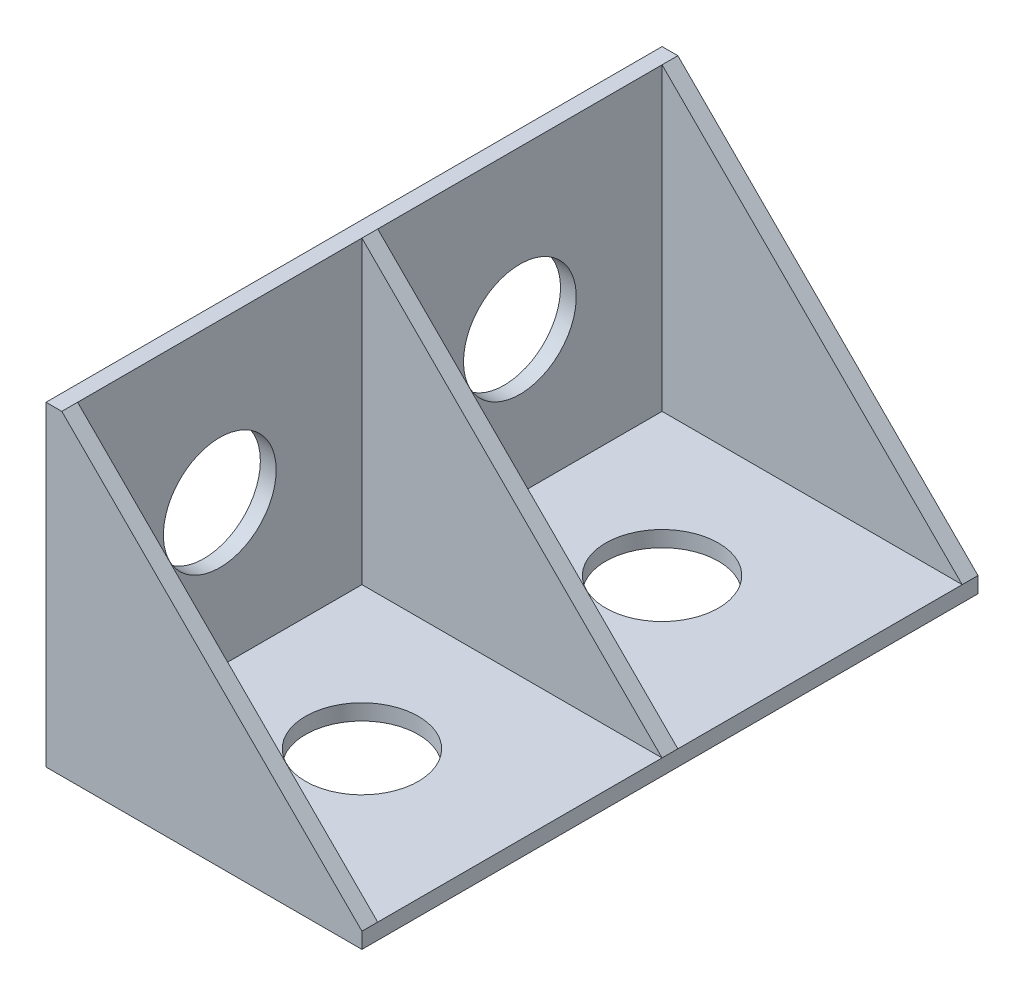
ISO-10303-21;
HEADER;
FILE_DESCRIPTION(('STEP AP214'),'2;1');
FILE_NAME('part.step','',(''),(''),'','','');
FILE_SCHEMA(('AUTOMOTIVE_DESIGN { 1 0 10303 214 1 1 1 1 }'));
ENDSEC;
DATA;
#1=APPLICATION_CONTEXT('core data for automotive mechanical design processes');
#2=APPLICATION_PROTOCOL_DEFINITION('international standard','automotive_design',2000,#1);
#3=PRODUCT_CONTEXT('',#1,'mechanical');
#4=PRODUCT('Part','Part','',(#3));
#5=PRODUCT_RELATED_PRODUCT_CATEGORY('part','',(#4));
#6=PRODUCT_DEFINITION_FORMATION('','',#4);
#7=PRODUCT_DEFINITION_CONTEXT('part definition',#1,'design');
#8=PRODUCT_DEFINITION('design','',#6,#7);
#9=PRODUCT_DEFINITION_SHAPE('','',#8);
#10=(LENGTH_UNIT() NAMED_UNIT(*) SI_UNIT(.MILLI.,.METRE.));
#11=(NAMED_UNIT(*) PLANE_ANGLE_UNIT() SI_UNIT($,.RADIAN.));
#12=(NAMED_UNIT(*) SI_UNIT($,.STERADIAN.) SOLID_ANGLE_UNIT());
#13=UNCERTAINTY_MEASURE_WITH_UNIT(LENGTH_MEASURE(1.E-05),#10,'distance_accuracy_value','');
#14=(GEOMETRIC_REPRESENTATION_CONTEXT(3) GLOBAL_UNCERTAINTY_ASSIGNED_CONTEXT((#13)) GLOBAL_UNIT_ASSIGNED_CONTEXT((#10,
#11,#12)) REPRESENTATION_CONTEXT('',''));
#15=CARTESIAN_POINT('',(0.,0.,0.));
#16=DIRECTION('',(0.,0.,1.));
#17=DIRECTION('',(1.,0.,0.));
#18=AXIS2_PLACEMENT_3D('',#15,#16,#17);
#19=CARTESIAN_POINT('',(7.29831834890795,7.29831834890795,10.));
#20=DIRECTION('',(0.,0.,1.));
#21=DIRECTION('',(1.,0.,0.));
#22=AXIS2_PLACEMENT_3D('',#19,#20,#21);
#23=PLANE('',#22);
#24=DIRECTION('',(0.,1.,0.));
#25=VECTOR('',#24,1.);
#26=CARTESIAN_POINT('',(0.999999999999985,-25.1725046566048,10.));
#27=LINE('',#26,#25);
#28=CARTESIAN_POINT('',(0.999999999999985,1.,10.));
#29=VERTEX_POINT('',#28);
#30=CARTESIAN_POINT('',(0.999999999999985,20.,10.));
#31=VERTEX_POINT('',#30);
#32=EDGE_CURVE('E158',#29,#31,#27,.T.);
#33=ORIENTED_EDGE('',*,*,#32,.F.);
#34=DIRECTION('',(1.,0.,0.));
#35=VECTOR('',#34,1.);
#36=CARTESIAN_POINT('',(-22.6725046566048,1.,10.));
#37=LINE('',#36,#35);
#38=CARTESIAN_POINT('',(20.,1.,10.));
#39=VERTEX_POINT('',#38);
#40=EDGE_CURVE('E57',#29,#39,#37,.T.);
#41=ORIENTED_EDGE('',*,*,#40,.T.);
#42=DIRECTION('',(-0.707106781186548,0.707106781186547,0.));
#43=VECTOR('',#42,1.);
#44=CARTESIAN_POINT('',(20.,1.,10.));
#45=LINE('',#44,#43);
#46=EDGE_CURVE('E219',#39,#31,#45,.T.);
#47=ORIENTED_EDGE('',*,*,#46,.T.);
#48=EDGE_LOOP('',(#33,#41,#47));
#49=FACE_BOUND('',#48,.T.);
#50=ADVANCED_FACE('F42',(#49),#23,.T.);
#51=CARTESIAN_POINT('',(20.,1.,0.));
#52=DIRECTION('',(0.707106781186547,0.707106781186548,0.));
#53=DIRECTION('',(0.,0.,-1.));
#54=AXIS2_PLACEMENT_3D('',#51,#52,#53);
#55=PLANE('',#54);
#56=DIRECTION('',(0.,0.,1.));
#57=VECTOR('',#56,1.);
#58=CARTESIAN_POINT('',(0.999999999999985,20.,0.));
#59=LINE('',#58,#57);
#60=CARTESIAN_POINT('',(0.999999999999985,20.,-10.));
#61=VERTEX_POINT('',#60);
#62=CARTESIAN_POINT('',(0.999999999999984,20.,-9.));
#63=VERTEX_POINT('',#62);
#64=EDGE_CURVE('E233',#61,#63,#59,.T.);
#65=ORIENTED_EDGE('',*,*,#64,.T.);
#66=DIRECTION('',(-0.707106781186548,0.707106781186547,0.));
#67=VECTOR('',#66,1.);
#68=CARTESIAN_POINT('',(20.,1.,-9.));
#69=LINE('',#68,#67);
#70=CARTESIAN_POINT('',(20.,1.,-9.));
#71=VERTEX_POINT('',#70);
#72=EDGE_CURVE('E50',#71,#63,#69,.T.);
#73=ORIENTED_EDGE('',*,*,#72,.F.);
#74=DIRECTION('',(0.,0.,1.));
#75=VECTOR('',#74,1.);
#76=CARTESIAN_POINT('',(20.,1.,0.));
#77=LINE('',#76,#75);
#78=CARTESIAN_POINT('',(20.,1.,-10.));
#79=VERTEX_POINT('',#78);
#80=EDGE_CURVE('E239',#79,#71,#77,.T.);
#81=ORIENTED_EDGE('',*,*,#80,.F.);
#82=DIRECTION('',(0.707106781186548,-0.707106781186547,0.));
#83=VECTOR('',#82,1.);
#84=CARTESIAN_POINT('',(20.,1.,-10.));
#85=LINE('',#84,#83);
#86=EDGE_CURVE('E245',#61,#79,#85,.T.);
#87=ORIENTED_EDGE('',*,*,#86,.F.);
#88=EDGE_LOOP('',(#65,#73,#81,#87));
#89=FACE_BOUND('',#88,.T.);
#90=ADVANCED_FACE('F271',(#89),#55,.T.);
#91=CARTESIAN_POINT('',(0.,10.,0.));
#92=DIRECTION('',(1.,0.,0.));
#93=DIRECTION('',(0.,0.,-1.));
#94=AXIS2_PLACEMENT_3D('',#91,#92,#93);
#95=CYLINDRICAL_SURFACE('',#94,3.57);
#96=CARTESIAN_POINT('',(0.999999999999985,10.,0.));
#97=DIRECTION('',(-1.,0.,0.));
#98=DIRECTION('',(0.,0.,1.));
#99=AXIS2_PLACEMENT_3D('',#96,#97,#98);
#100=CIRCLE('',#99,3.57);
#101=CARTESIAN_POINT('',(0.999999999999985,10.,3.57));
#102=VERTEX_POINT('',#101);
#103=EDGE_CURVE('E204',#102,#102,#100,.F.);
#104=ORIENTED_EDGE('',*,*,#103,.T.);
#105=EDGE_LOOP('',(#104));
#106=FACE_BOUND('',#105,.T.);
#107=CARTESIAN_POINT('',(0.,10.,0.));
#108=DIRECTION('',(1.,0.,0.));
#109=DIRECTION('',(0.,0.,-1.));
#110=AXIS2_PLACEMENT_3D('',#107,#108,#109);
#111=CIRCLE('',#110,3.57);
#112=CARTESIAN_POINT('',(0.,10.,3.57));
#113=VERTEX_POINT('',#112);
#114=EDGE_CURVE('E223',#113,#113,#111,.T.);
#115=ORIENTED_EDGE('',*,*,#114,.F.);
#116=EDGE_LOOP('',(#115));
#117=FACE_BOUND('',#116,.T.);
#118=ADVANCED_FACE('F44',(#106,#117),#95,.F.);
#119=CARTESIAN_POINT('',(10.,0.,0.));
#120=DIRECTION('',(0.,1.,0.));
#121=DIRECTION('',(-1.,0.,0.));
#122=AXIS2_PLACEMENT_3D('',#119,#120,#121);
#123=CYLINDRICAL_SURFACE('',#122,3.57);
#124=CARTESIAN_POINT('',(10.,1.,0.));
#125=DIRECTION('',(0.,-1.,0.));
#126=DIRECTION('',(0.,0.,-1.));
#127=AXIS2_PLACEMENT_3D('',#124,#125,#126);
#128=CIRCLE('',#127,3.57);
#129=CARTESIAN_POINT('',(10.,1.,-3.57));
#130=VERTEX_POINT('',#129);
#131=EDGE_CURVE('E215',#130,#130,#128,.F.);
#132=ORIENTED_EDGE('',*,*,#131,.T.);
#133=EDGE_LOOP('',(#132));
#134=FACE_BOUND('',#133,.T.);
#135=CARTESIAN_POINT('',(10.,0.,0.));
#136=DIRECTION('',(0.,1.,0.));
#137=DIRECTION('',(-1.,0.,0.));
#138=AXIS2_PLACEMENT_3D('',#135,#136,#137);
#139=CIRCLE('',#138,3.57);
#140=CARTESIAN_POINT('',(13.57,0.,0.));
#141=VERTEX_POINT('',#140);
#142=EDGE_CURVE('E238',#141,#141,#139,.T.);
#143=ORIENTED_EDGE('',*,*,#142,.F.);
#144=EDGE_LOOP('',(#143));
#145=FACE_BOUND('',#144,.T.);
#146=ADVANCED_FACE('F323',(#134,#145),#123,.F.);
#147=CARTESIAN_POINT('',(7.29831834890795,7.29831834890795,-10.));
#148=DIRECTION('',(0.,0.,-1.));
#149=DIRECTION('',(0.,-1.,0.));
#150=AXIS2_PLACEMENT_3D('',#147,#148,#149);
#151=PLANE('',#150);
#152=DIRECTION('',(-1.,0.,0.));
#153=VECTOR('',#152,1.);
#154=CARTESIAN_POINT('',(0.,0.,-10.));
#155=LINE('',#154,#153);
#156=CARTESIAN_POINT('',(20.,0.,-10.));
#157=VERTEX_POINT('',#156);
#158=CARTESIAN_POINT('',(0.,0.,-10.));
#159=VERTEX_POINT('',#158);
#160=EDGE_CURVE('E231',#157,#159,#155,.T.);
#161=ORIENTED_EDGE('',*,*,#160,.T.);
#162=DIRECTION('',(0.,1.,0.));
#163=VECTOR('',#162,1.);
#164=CARTESIAN_POINT('',(0.,20.,-10.));
#165=LINE('',#164,#163);
#166=CARTESIAN_POINT('',(0.,20.,-10.));
#167=VERTEX_POINT('',#166);
#168=EDGE_CURVE('E228',#159,#167,#165,.T.);
#169=ORIENTED_EDGE('',*,*,#168,.T.);
#170=DIRECTION('',(1.,0.,0.));
#171=VECTOR('',#170,1.);
#172=CARTESIAN_POINT('',(0.999999999999985,20.,-10.));
#173=LINE('',#172,#171);
#174=EDGE_CURVE('E232',#167,#61,#173,.T.);
#175=ORIENTED_EDGE('',*,*,#174,.T.);
#176=ORIENTED_EDGE('',*,*,#86,.T.);
#177=DIRECTION('',(0.,-1.,0.));
#178=VECTOR('',#177,1.);
#179=CARTESIAN_POINT('',(20.,0.,-10.));
#180=LINE('',#179,#178);
#181=EDGE_CURVE('E226',#79,#157,#180,.T.);
#182=ORIENTED_EDGE('',*,*,#181,.T.);
#183=EDGE_LOOP('',(#161,#169,#175,#176,#182));
#184=FACE_BOUND('',#183,.T.);
#185=ADVANCED_FACE('F273',(#184),#151,.T.);
#186=CARTESIAN_POINT('',(0.,20.,0.));
#187=DIRECTION('',(-1.,0.,0.));
#188=DIRECTION('',(0.,1.,0.));
#189=AXIS2_PLACEMENT_3D('',#186,#187,#188);
#190=PLANE('',#189);
#191=ORIENTED_EDGE('',*,*,#168,.F.);
#192=DIRECTION('',(0.,0.,-1.));
#193=VECTOR('',#192,1.);
#194=CARTESIAN_POINT('',(0.,0.,0.));
#195=LINE('',#194,#193);
#196=CARTESIAN_POINT('',(0.,0.,29.));
#197=VERTEX_POINT('',#196);
#198=EDGE_CURVE('E220',#197,#159,#195,.T.);
#199=ORIENTED_EDGE('',*,*,#198,.F.);
#200=DIRECTION('',(0.,1.,0.));
#201=VECTOR('',#200,1.);
#202=CARTESIAN_POINT('',(0.,20.,29.));
#203=LINE('',#202,#201);
#204=CARTESIAN_POINT('',(0.,20.,29.));
#205=VERTEX_POINT('',#204);
#206=EDGE_CURVE('E176',#197,#205,#203,.T.);
#207=ORIENTED_EDGE('',*,*,#206,.T.);
#208=DIRECTION('',(0.,0.,1.));
#209=VECTOR('',#208,1.);
#210=CARTESIAN_POINT('',(0.,20.,0.));
#211=LINE('',#210,#209);
#212=EDGE_CURVE('E227',#167,#205,#211,.T.);
#213=ORIENTED_EDGE('',*,*,#212,.F.);
#214=EDGE_LOOP('',(#191,#199,#207,#213));
#215=FACE_BOUND('',#214,.T.);
#216=ORIENTED_EDGE('',*,*,#114,.T.);
#217=EDGE_LOOP('',(#216));
#218=FACE_BOUND('',#217,.T.);
#219=CARTESIAN_POINT('',(0.,10.,19.));
#220=DIRECTION('',(-1.,0.,0.));
#221=DIRECTION('',(0.,0.,1.));
#222=AXIS2_PLACEMENT_3D('',#219,#220,#221);
#223=CIRCLE('',#222,3.57);
#224=CARTESIAN_POINT('',(0.,10.,15.43));
#225=VERTEX_POINT('',#224);
#226=EDGE_CURVE('E172',#225,#225,#223,.T.);
#227=ORIENTED_EDGE('',*,*,#226,.F.);
#228=EDGE_LOOP('',(#227));
#229=FACE_BOUND('',#228,.T.);
#230=ADVANCED_FACE('F280',(#215,#218,#229),#190,.T.);
#231=CARTESIAN_POINT('',(0.999999999999985,20.,0.));
#232=DIRECTION('',(0.,1.,0.));
#233=DIRECTION('',(1.,0.,0.));
#234=AXIS2_PLACEMENT_3D('',#231,#232,#233);
#235=PLANE('',#234);
#236=ORIENTED_EDGE('',*,*,#212,.T.);
#237=DIRECTION('',(1.,0.,0.));
#238=VECTOR('',#237,1.);
#239=CARTESIAN_POINT('',(0.999999999999985,20.,29.));
#240=LINE('',#239,#238);
#241=CARTESIAN_POINT('',(0.999999999999985,20.,29.));
#242=VERTEX_POINT('',#241);
#243=EDGE_CURVE('E180',#205,#242,#240,.T.);
#244=ORIENTED_EDGE('',*,*,#243,.T.);
#245=DIRECTION('',(0.,0.,-1.));
#246=VECTOR('',#245,1.);
#247=CARTESIAN_POINT('',(0.999999999999985,20.,19.));
#248=LINE('',#247,#246);
#249=CARTESIAN_POINT('',(0.999999999999984,20.,28.));
#250=VERTEX_POINT('',#249);
#251=EDGE_CURVE('E175',#242,#250,#248,.T.);
#252=ORIENTED_EDGE('',*,*,#251,.T.);
#253=DIRECTION('',(0.,0.,-1.));
#254=VECTOR('',#253,1.);
#255=CARTESIAN_POINT('',(0.999999999999984,20.,28.));
#256=LINE('',#255,#254);
#257=EDGE_CURVE('E144',#250,#31,#256,.T.);
#258=ORIENTED_EDGE('',*,*,#257,.T.);
#259=CARTESIAN_POINT('',(0.999999999999985,20.,9.));
#260=VERTEX_POINT('',#259);
#261=EDGE_CURVE('E236',#260,#31,#59,.T.);
#262=ORIENTED_EDGE('',*,*,#261,.F.);
#263=DIRECTION('',(0.,0.,1.));
#264=VECTOR('',#263,1.);
#265=CARTESIAN_POINT('',(0.999999999999984,20.,-9.));
#266=LINE('',#265,#264);
#267=EDGE_CURVE('E195',#63,#260,#266,.T.);
#268=ORIENTED_EDGE('',*,*,#267,.F.);
#269=ORIENTED_EDGE('',*,*,#64,.F.);
#270=ORIENTED_EDGE('',*,*,#174,.F.);
#271=EDGE_LOOP('',(#236,#244,#252,#258,#262,#268,#269,#270));
#272=FACE_BOUND('',#271,.T.);
#273=ADVANCED_FACE('F270',(#272),#235,.T.);
#274=DIRECTION('',(0.707106781186548,-0.707106781186547,0.));
#275=VECTOR('',#274,1.);
#276=CARTESIAN_POINT('',(20.,0.999999999999999,9.));
#277=LINE('',#276,#275);
#278=CARTESIAN_POINT('',(20.,1.,9.));
#279=VERTEX_POINT('',#278);
#280=EDGE_CURVE('E11',#260,#279,#277,.T.);
#281=ORIENTED_EDGE('',*,*,#280,.F.);
#282=ORIENTED_EDGE('',*,*,#261,.T.);
#283=ORIENTED_EDGE('',*,*,#46,.F.);
#284=EDGE_CURVE('E242',#279,#39,#77,.T.);
#285=ORIENTED_EDGE('',*,*,#284,.F.);
#286=EDGE_LOOP('',(#281,#282,#283,#285));
#287=FACE_BOUND('',#286,.T.);
#288=ADVANCED_FACE('F290',(#287),#55,.T.);
#289=CARTESIAN_POINT('',(20.,0.,0.));
#290=DIRECTION('',(1.,0.,0.));
#291=DIRECTION('',(0.,1.,0.));
#292=AXIS2_PLACEMENT_3D('',#289,#290,#291);
#293=PLANE('',#292);
#294=DIRECTION('',(0.,0.,-1.));
#295=VECTOR('',#294,1.);
#296=CARTESIAN_POINT('',(20.,1.,9.));
#297=LINE('',#296,#295);
#298=EDGE_CURVE('E209',#279,#71,#297,.T.);
#299=ORIENTED_EDGE('',*,*,#298,.F.);
#300=ORIENTED_EDGE('',*,*,#284,.T.);
#301=DIRECTION('',(0.,0.,1.));
#302=VECTOR('',#301,1.);
#303=CARTESIAN_POINT('',(20.,1.,10.));
#304=LINE('',#303,#302);
#305=CARTESIAN_POINT('',(20.,1.,28.));
#306=VERTEX_POINT('',#305);
#307=EDGE_CURVE('E166',#39,#306,#304,.T.);
#308=ORIENTED_EDGE('',*,*,#307,.T.);
#309=DIRECTION('',(0.,0.,-1.));
#310=VECTOR('',#309,1.);
#311=CARTESIAN_POINT('',(20.,1.,19.));
#312=LINE('',#311,#310);
#313=CARTESIAN_POINT('',(20.,1.,29.));
#314=VERTEX_POINT('',#313);
#315=EDGE_CURVE('E183',#314,#306,#312,.T.);
#316=ORIENTED_EDGE('',*,*,#315,.F.);
#317=DIRECTION('',(0.,-1.,0.));
#318=VECTOR('',#317,1.);
#319=CARTESIAN_POINT('',(20.,0.,29.));
#320=LINE('',#319,#318);
#321=CARTESIAN_POINT('',(20.,0.,29.));
#322=VERTEX_POINT('',#321);
#323=EDGE_CURVE('E174',#314,#322,#320,.T.);
#324=ORIENTED_EDGE('',*,*,#323,.T.);
#325=DIRECTION('',(0.,0.,1.));
#326=VECTOR('',#325,1.);
#327=CARTESIAN_POINT('',(20.,0.,0.));
#328=LINE('',#327,#326);
#329=EDGE_CURVE('E222',#157,#322,#328,.T.);
#330=ORIENTED_EDGE('',*,*,#329,.F.);
#331=ORIENTED_EDGE('',*,*,#181,.F.);
#332=ORIENTED_EDGE('',*,*,#80,.T.);
#333=EDGE_LOOP('',(#299,#300,#308,#316,#324,#330,#331,#332));
#334=FACE_BOUND('',#333,.T.);
#335=ADVANCED_FACE('F295',(#334),#293,.T.);
#336=CARTESIAN_POINT('',(0.,0.,0.));
#337=DIRECTION('',(0.,-1.,0.));
#338=DIRECTION('',(0.,0.,-1.));
#339=AXIS2_PLACEMENT_3D('',#336,#337,#338);
#340=PLANE('',#339);
#341=ORIENTED_EDGE('',*,*,#329,.T.);
#342=DIRECTION('',(-1.,0.,0.));
#343=VECTOR('',#342,1.);
#344=CARTESIAN_POINT('',(0.,0.,29.));
#345=LINE('',#344,#343);
#346=EDGE_CURVE('E179',#322,#197,#345,.T.);
#347=ORIENTED_EDGE('',*,*,#346,.T.);
#348=ORIENTED_EDGE('',*,*,#198,.T.);
#349=ORIENTED_EDGE('',*,*,#160,.F.);
#350=EDGE_LOOP('',(#341,#347,#348,#349));
#351=FACE_BOUND('',#350,.T.);
#352=ORIENTED_EDGE('',*,*,#142,.T.);
#353=EDGE_LOOP('',(#352));
#354=FACE_BOUND('',#353,.T.);
#355=CARTESIAN_POINT('',(10.,0.,19.));
#356=DIRECTION('',(0.,-1.,0.));
#357=DIRECTION('',(-1.,0.,0.));
#358=AXIS2_PLACEMENT_3D('',#355,#356,#357);
#359=CIRCLE('',#358,3.57);
#360=CARTESIAN_POINT('',(13.57,0.,19.));
#361=VERTEX_POINT('',#360);
#362=EDGE_CURVE('E171',#361,#361,#359,.T.);
#363=ORIENTED_EDGE('',*,*,#362,.F.);
#364=EDGE_LOOP('',(#363));
#365=FACE_BOUND('',#364,.T.);
#366=ADVANCED_FACE('F308',(#351,#354,#365),#340,.T.);
#367=CARTESIAN_POINT('',(-22.6725046566048,1.,9.));
#368=DIRECTION('',(0.,-1.,0.));
#369=DIRECTION('',(0.,0.,-1.));
#370=AXIS2_PLACEMENT_3D('',#367,#368,#369);
#371=PLANE('',#370);
#372=DIRECTION('',(1.,0.,0.));
#373=VECTOR('',#372,1.);
#374=CARTESIAN_POINT('',(-22.6725046566048,1.,9.));
#375=LINE('',#374,#373);
#376=CARTESIAN_POINT('',(0.999999999999985,1.,9.));
#377=VERTEX_POINT('',#376);
#378=EDGE_CURVE('E212',#377,#279,#375,.T.);
#379=ORIENTED_EDGE('',*,*,#378,.T.);
#380=ORIENTED_EDGE('',*,*,#298,.T.);
#381=DIRECTION('',(1.,0.,0.));
#382=VECTOR('',#381,1.);
#383=CARTESIAN_POINT('',(-22.6725046566048,1.,-9.));
#384=LINE('',#383,#382);
#385=CARTESIAN_POINT('',(0.999999999999984,1.,-9.));
#386=VERTEX_POINT('',#385);
#387=EDGE_CURVE('E213',#386,#71,#384,.T.);
#388=ORIENTED_EDGE('',*,*,#387,.F.);
#389=DIRECTION('',(0.,0.,1.));
#390=VECTOR('',#389,1.);
#391=CARTESIAN_POINT('',(0.999999999999984,1.,-9.));
#392=LINE('',#391,#390);
#393=EDGE_CURVE('E198',#386,#377,#392,.T.);
#394=ORIENTED_EDGE('',*,*,#393,.T.);
#395=EDGE_LOOP('',(#379,#380,#388,#394));
#396=FACE_BOUND('',#395,.T.);
#397=ORIENTED_EDGE('',*,*,#131,.F.);
#398=EDGE_LOOP('',(#397));
#399=FACE_BOUND('',#398,.T.);
#400=ADVANCED_FACE('F297',(#396,#399),#371,.F.);
#401=CARTESIAN_POINT('',(-22.6725046566048,20.,9.));
#402=DIRECTION('',(0.,0.,1.));
#403=DIRECTION('',(0.,-1.,0.));
#404=AXIS2_PLACEMENT_3D('',#401,#402,#403);
#405=PLANE('',#404);
#406=ORIENTED_EDGE('',*,*,#280,.T.);
#407=ORIENTED_EDGE('',*,*,#378,.F.);
#408=DIRECTION('',(0.,1.,0.));
#409=VECTOR('',#408,1.);
#410=CARTESIAN_POINT('',(0.999999999999985,-25.1725046566048,9.));
#411=LINE('',#410,#409);
#412=EDGE_CURVE('E201',#377,#260,#411,.T.);
#413=ORIENTED_EDGE('',*,*,#412,.T.);
#414=EDGE_LOOP('',(#406,#407,#413));
#415=FACE_BOUND('',#414,.T.);
#416=ADVANCED_FACE('F300',(#415),#405,.F.);
#417=CARTESIAN_POINT('',(-22.6725046566048,1.,-9.));
#418=DIRECTION('',(0.,0.,-1.));
#419=DIRECTION('',(0.,1.,0.));
#420=AXIS2_PLACEMENT_3D('',#417,#418,#419);
#421=PLANE('',#420);
#422=ORIENTED_EDGE('',*,*,#72,.T.);
#423=DIRECTION('',(0.,1.,0.));
#424=VECTOR('',#423,1.);
#425=CARTESIAN_POINT('',(0.999999999999984,-25.1725046566048,-9.));
#426=LINE('',#425,#424);
#427=EDGE_CURVE('E197',#386,#63,#426,.T.);
#428=ORIENTED_EDGE('',*,*,#427,.F.);
#429=ORIENTED_EDGE('',*,*,#387,.T.);
#430=EDGE_LOOP('',(#422,#428,#429));
#431=FACE_BOUND('',#430,.T.);
#432=ADVANCED_FACE('F258',(#431),#421,.F.);
#433=CARTESIAN_POINT('',(0.999999999999984,-25.1725046566048,-9.));
#434=DIRECTION('',(-1.,0.,0.));
#435=DIRECTION('',(0.,0.,1.));
#436=AXIS2_PLACEMENT_3D('',#433,#434,#435);
#437=PLANE('',#436);
#438=ORIENTED_EDGE('',*,*,#427,.T.);
#439=ORIENTED_EDGE('',*,*,#267,.T.);
#440=ORIENTED_EDGE('',*,*,#412,.F.);
#441=ORIENTED_EDGE('',*,*,#393,.F.);
#442=EDGE_LOOP('',(#438,#439,#440,#441));
#443=FACE_BOUND('',#442,.T.);
#444=ORIENTED_EDGE('',*,*,#103,.F.);
#445=EDGE_LOOP('',(#444));
#446=FACE_BOUND('',#445,.T.);
#447=ADVANCED_FACE('F264',(#443,#446),#437,.F.);
#448=CARTESIAN_POINT('',(20.,1.,19.));
#449=DIRECTION('',(0.707106781186547,0.707106781186548,0.));
#450=DIRECTION('',(0.,0.,1.));
#451=AXIS2_PLACEMENT_3D('',#448,#449,#450);
#452=PLANE('',#451);
#453=ORIENTED_EDGE('',*,*,#251,.F.);
#454=DIRECTION('',(0.707106781186548,-0.707106781186547,0.));
#455=VECTOR('',#454,1.);
#456=CARTESIAN_POINT('',(20.,1.,29.));
#457=LINE('',#456,#455);
#458=EDGE_CURVE('E186',#242,#314,#457,.T.);
#459=ORIENTED_EDGE('',*,*,#458,.T.);
#460=ORIENTED_EDGE('',*,*,#315,.T.);
#461=DIRECTION('',(-0.707106781186548,0.707106781186547,0.));
#462=VECTOR('',#461,1.);
#463=CARTESIAN_POINT('',(20.,1.,28.));
#464=LINE('',#463,#462);
#465=EDGE_CURVE('E151',#306,#250,#464,.T.);
#466=ORIENTED_EDGE('',*,*,#465,.T.);
#467=EDGE_LOOP('',(#453,#459,#460,#466));
#468=FACE_BOUND('',#467,.T.);
#469=ADVANCED_FACE('F288',(#468),#452,.T.);
#470=CARTESIAN_POINT('',(0.,10.,19.));
#471=DIRECTION('',(1.,0.,0.));
#472=DIRECTION('',(0.,0.,1.));
#473=AXIS2_PLACEMENT_3D('',#470,#471,#472);
#474=CYLINDRICAL_SURFACE('',#473,3.57);
#475=CARTESIAN_POINT('',(0.999999999999985,10.,19.));
#476=DIRECTION('',(1.,0.,0.));
#477=DIRECTION('',(0.,0.,-1.));
#478=AXIS2_PLACEMENT_3D('',#475,#476,#477);
#479=CIRCLE('',#478,3.57);
#480=CARTESIAN_POINT('',(0.999999999999985,10.,15.43));
#481=VERTEX_POINT('',#480);
#482=EDGE_CURVE('E160',#481,#481,#479,.F.);
#483=ORIENTED_EDGE('',*,*,#482,.F.);
#484=EDGE_LOOP('',(#483));
#485=FACE_BOUND('',#484,.T.);
#486=ORIENTED_EDGE('',*,*,#226,.T.);
#487=EDGE_LOOP('',(#486));
#488=FACE_BOUND('',#487,.T.);
#489=ADVANCED_FACE('F348',(#485,#488),#474,.F.);
#490=CARTESIAN_POINT('',(10.,0.,19.));
#491=DIRECTION('',(0.,1.,0.));
#492=DIRECTION('',(-1.,0.,0.));
#493=AXIS2_PLACEMENT_3D('',#490,#491,#492);
#494=CYLINDRICAL_SURFACE('',#493,3.57);
#495=CARTESIAN_POINT('',(10.,1.,19.));
#496=DIRECTION('',(0.,1.,0.));
#497=DIRECTION('',(0.,0.,1.));
#498=AXIS2_PLACEMENT_3D('',#495,#496,#497);
#499=CIRCLE('',#498,3.57);
#500=CARTESIAN_POINT('',(10.,1.,22.57));
#501=VERTEX_POINT('',#500);
#502=EDGE_CURVE('E154',#501,#501,#499,.F.);
#503=ORIENTED_EDGE('',*,*,#502,.F.);
#504=EDGE_LOOP('',(#503));
#505=FACE_BOUND('',#504,.T.);
#506=ORIENTED_EDGE('',*,*,#362,.T.);
#507=EDGE_LOOP('',(#506));
#508=FACE_BOUND('',#507,.T.);
#509=ADVANCED_FACE('F346',(#505,#508),#494,.F.);
#510=CARTESIAN_POINT('',(7.29831834890795,7.29831834890795,29.));
#511=DIRECTION('',(0.,0.,1.));
#512=DIRECTION('',(0.,-1.,0.));
#513=AXIS2_PLACEMENT_3D('',#510,#511,#512);
#514=PLANE('',#513);
#515=ORIENTED_EDGE('',*,*,#346,.F.);
#516=ORIENTED_EDGE('',*,*,#323,.F.);
#517=ORIENTED_EDGE('',*,*,#458,.F.);
#518=ORIENTED_EDGE('',*,*,#243,.F.);
#519=ORIENTED_EDGE('',*,*,#206,.F.);
#520=EDGE_LOOP('',(#515,#516,#517,#518,#519));
#521=FACE_BOUND('',#520,.T.);
#522=ADVANCED_FACE('F284',(#521),#514,.T.);
#523=CARTESIAN_POINT('',(-22.6725046566048,1.,10.));
#524=DIRECTION('',(0.,-1.,0.));
#525=DIRECTION('',(0.,0.,1.));
#526=AXIS2_PLACEMENT_3D('',#523,#524,#525);
#527=PLANE('',#526);
#528=ORIENTED_EDGE('',*,*,#40,.F.);
#529=DIRECTION('',(0.,0.,-1.));
#530=VECTOR('',#529,1.);
#531=CARTESIAN_POINT('',(0.999999999999984,1.,28.));
#532=LINE('',#531,#530);
#533=CARTESIAN_POINT('',(0.999999999999984,1.,28.));
#534=VERTEX_POINT('',#533);
#535=EDGE_CURVE('E141',#534,#29,#532,.T.);
#536=ORIENTED_EDGE('',*,*,#535,.F.);
#537=DIRECTION('',(1.,0.,0.));
#538=VECTOR('',#537,1.);
#539=CARTESIAN_POINT('',(-22.6725046566048,1.,28.));
#540=LINE('',#539,#538);
#541=EDGE_CURVE('E149',#534,#306,#540,.T.);
#542=ORIENTED_EDGE('',*,*,#541,.T.);
#543=ORIENTED_EDGE('',*,*,#307,.F.);
#544=EDGE_LOOP('',(#528,#536,#542,#543));
#545=FACE_BOUND('',#544,.T.);
#546=ORIENTED_EDGE('',*,*,#502,.T.);
#547=EDGE_LOOP('',(#546));
#548=FACE_BOUND('',#547,.T.);
#549=ADVANCED_FACE('F156',(#545,#548),#527,.F.);
#550=CARTESIAN_POINT('',(-22.6725046566048,1.,28.));
#551=DIRECTION('',(0.,0.,1.));
#552=DIRECTION('',(0.,1.,0.));
#553=AXIS2_PLACEMENT_3D('',#550,#551,#552);
#554=PLANE('',#553);
#555=ORIENTED_EDGE('',*,*,#465,.F.);
#556=ORIENTED_EDGE('',*,*,#541,.F.);
#557=DIRECTION('',(0.,1.,0.));
#558=VECTOR('',#557,1.);
#559=CARTESIAN_POINT('',(0.999999999999984,-25.1725046566048,28.));
#560=LINE('',#559,#558);
#561=EDGE_CURVE('E137',#534,#250,#560,.T.);
#562=ORIENTED_EDGE('',*,*,#561,.T.);
#563=EDGE_LOOP('',(#555,#556,#562));
#564=FACE_BOUND('',#563,.T.);
#565=ADVANCED_FACE('F150',(#564),#554,.F.);
#566=CARTESIAN_POINT('',(0.999999999999984,-25.1725046566048,28.));
#567=DIRECTION('',(-1.,0.,0.));
#568=DIRECTION('',(0.,0.,-1.));
#569=AXIS2_PLACEMENT_3D('',#566,#567,#568);
#570=PLANE('',#569);
#571=ORIENTED_EDGE('',*,*,#561,.F.);
#572=ORIENTED_EDGE('',*,*,#535,.T.);
#573=ORIENTED_EDGE('',*,*,#32,.T.);
#574=ORIENTED_EDGE('',*,*,#257,.F.);
#575=EDGE_LOOP('',(#571,#572,#573,#574));
#576=FACE_BOUND('',#575,.T.);
#577=ORIENTED_EDGE('',*,*,#482,.T.);
#578=EDGE_LOOP('',(#577));
#579=FACE_BOUND('',#578,.T.);
#580=ADVANCED_FACE('F139',(#576,#579),#570,.F.);
#581=CLOSED_SHELL('',(#50,#90,#118,#146,#185,#230,#273,#288,#335,#366,#400,#416,#432,#447,#469,
#489,#509,#522,#549,#565,#580));
#582=MANIFOLD_SOLID_BREP('B2',#581);
#583=ADVANCED_BREP_SHAPE_REPRESENTATION('',(#18,#582),#14);
#584=SHAPE_DEFINITION_REPRESENTATION(#9,#583);
ENDSEC;
END-ISO-10303-21;
